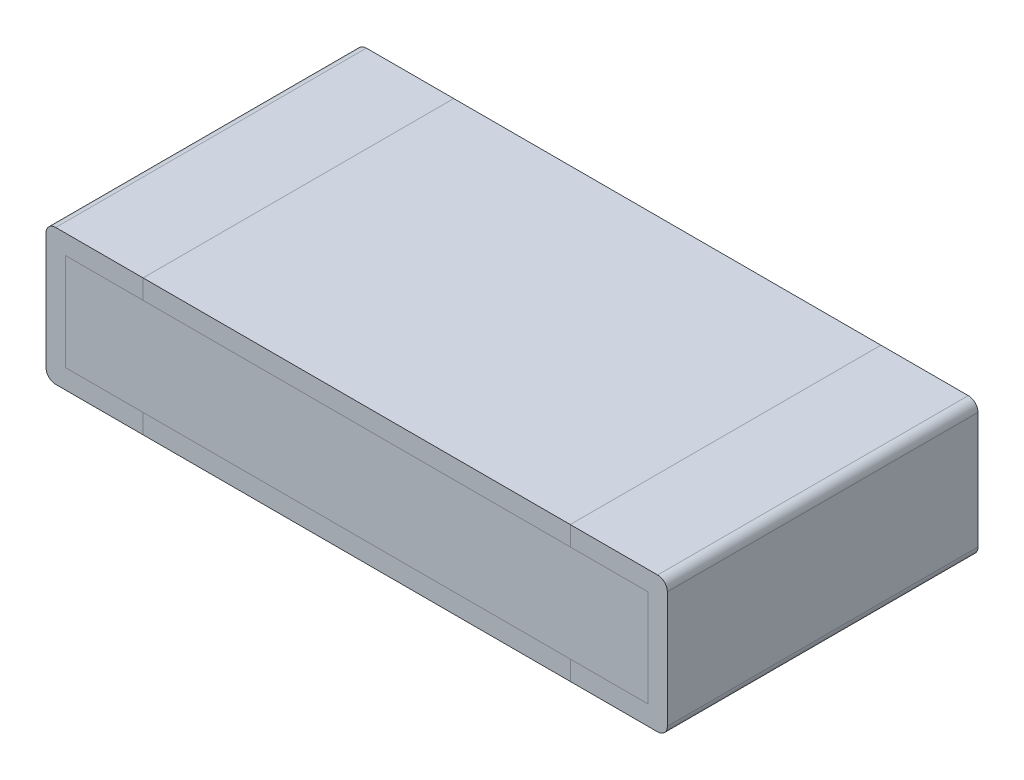
ISO-10303-21;
HEADER;
FILE_DESCRIPTION(('STEP AP214'),'2;1');
FILE_NAME('part.step','',(''),(''),'','','');
FILE_SCHEMA(('AUTOMOTIVE_DESIGN { 1 0 10303 214 1 1 1 1 }'));
ENDSEC;
DATA;
#1=APPLICATION_CONTEXT('core data for automotive mechanical design processes');
#2=APPLICATION_PROTOCOL_DEFINITION('international standard','automotive_design',2000,#1);
#3=PRODUCT_CONTEXT('',#1,'mechanical');
#4=PRODUCT('Part','Part','',(#3));
#5=PRODUCT_RELATED_PRODUCT_CATEGORY('part','',(#4));
#6=PRODUCT_DEFINITION_FORMATION('','',#4);
#7=PRODUCT_DEFINITION_CONTEXT('part definition',#1,'design');
#8=PRODUCT_DEFINITION('design','',#6,#7);
#9=PRODUCT_DEFINITION_SHAPE('','',#8);
#10=(LENGTH_UNIT() NAMED_UNIT(*) SI_UNIT(.MILLI.,.METRE.));
#11=(NAMED_UNIT(*) PLANE_ANGLE_UNIT() SI_UNIT($,.RADIAN.));
#12=(NAMED_UNIT(*) SI_UNIT($,.STERADIAN.) SOLID_ANGLE_UNIT());
#13=UNCERTAINTY_MEASURE_WITH_UNIT(LENGTH_MEASURE(1.E-05),#10,'distance_accuracy_value','');
#14=(GEOMETRIC_REPRESENTATION_CONTEXT(3) GLOBAL_UNCERTAINTY_ASSIGNED_CONTEXT((#13)) GLOBAL_UNIT_ASSIGNED_CONTEXT((#10,
#11,#12)) REPRESENTATION_CONTEXT('',''));
#15=CARTESIAN_POINT('',(0.,0.,0.));
#16=DIRECTION('',(0.,0.,1.));
#17=DIRECTION('',(1.,0.,0.));
#18=AXIS2_PLACEMENT_3D('',#15,#16,#17);
#19=CARTESIAN_POINT('',(0.,0.1,0.));
#20=DIRECTION('',(0.,-1.,0.));
#21=DIRECTION('',(0.,0.,-1.));
#22=AXIS2_PLACEMENT_3D('',#19,#20,#21);
#23=PLANE('',#22);
#24=DIRECTION('',(0.,0.,-1.));
#25=VECTOR('',#24,1.);
#26=CARTESIAN_POINT('',(-1.5,0.1,0.8));
#27=LINE('',#26,#25);
#28=CARTESIAN_POINT('',(-1.5,0.1,0.8));
#29=VERTEX_POINT('',#28);
#30=CARTESIAN_POINT('',(-1.5,0.1,-0.8));
#31=VERTEX_POINT('',#30);
#32=EDGE_CURVE('P0_E54',#29,#31,#27,.T.);
#33=ORIENTED_EDGE('',*,*,#32,.T.);
#34=DIRECTION('',(1.,0.,0.));
#35=VECTOR('',#34,1.);
#36=CARTESIAN_POINT('',(-1.5,0.1,-0.8));
#37=LINE('',#36,#35);
#38=CARTESIAN_POINT('',(1.5,0.1,-0.8));
#39=VERTEX_POINT('',#38);
#40=EDGE_CURVE('P0_E76',#31,#39,#37,.T.);
#41=ORIENTED_EDGE('',*,*,#40,.T.);
#42=DIRECTION('',(0.,0.,-1.));
#43=VECTOR('',#42,1.);
#44=CARTESIAN_POINT('',(1.5,0.1,0.));
#45=LINE('',#44,#43);
#46=CARTESIAN_POINT('',(1.5,0.1,0.8));
#47=VERTEX_POINT('',#46);
#48=EDGE_CURVE('P0_E19',#39,#47,#45,.F.);
#49=ORIENTED_EDGE('',*,*,#48,.T.);
#50=DIRECTION('',(-1.,0.,0.));
#51=VECTOR('',#50,1.);
#52=CARTESIAN_POINT('',(-1.5,0.1,0.8));
#53=LINE('',#52,#51);
#54=EDGE_CURVE('P0_E57',#47,#29,#53,.T.);
#55=ORIENTED_EDGE('',*,*,#54,.T.);
#56=EDGE_LOOP('',(#33,#41,#49,#55));
#57=FACE_BOUND('',#56,.T.);
#58=ADVANCED_FACE('P0_F16',(#57),#23,.T.);
#59=CARTESIAN_POINT('',(-1.5,0.6,0.8));
#60=DIRECTION('',(0.,0.,-1.));
#61=DIRECTION('',(-1.,0.,0.));
#62=AXIS2_PLACEMENT_3D('',#59,#60,#61);
#63=PLANE('',#62);
#64=DIRECTION('',(0.,1.,0.));
#65=VECTOR('',#64,1.);
#66=CARTESIAN_POINT('',(1.5,0.6,0.8));
#67=LINE('',#66,#65);
#68=CARTESIAN_POINT('',(1.5,0.6,0.8));
#69=VERTEX_POINT('',#68);
#70=EDGE_CURVE('P0_E78',#47,#69,#67,.T.);
#71=ORIENTED_EDGE('',*,*,#70,.T.);
#72=DIRECTION('',(1.,0.,0.));
#73=VECTOR('',#72,1.);
#74=CARTESIAN_POINT('',(0.,0.6,0.8));
#75=LINE('',#74,#73);
#76=CARTESIAN_POINT('',(-1.5,0.6,0.8));
#77=VERTEX_POINT('',#76);
#78=EDGE_CURVE('P0_E72',#69,#77,#75,.F.);
#79=ORIENTED_EDGE('',*,*,#78,.T.);
#80=DIRECTION('',(0.,1.,0.));
#81=VECTOR('',#80,1.);
#82=CARTESIAN_POINT('',(-1.5,0.6,0.8));
#83=LINE('',#82,#81);
#84=EDGE_CURVE('P0_E62',#77,#29,#83,.F.);
#85=ORIENTED_EDGE('',*,*,#84,.T.);
#86=ORIENTED_EDGE('',*,*,#54,.F.);
#87=EDGE_LOOP('',(#71,#79,#85,#86));
#88=FACE_BOUND('',#87,.T.);
#89=ADVANCED_FACE('P0_F71',(#88),#63,.F.);
#90=CARTESIAN_POINT('',(-1.5,0.6,0.8));
#91=DIRECTION('',(1.,0.,0.));
#92=DIRECTION('',(0.,0.,-1.));
#93=AXIS2_PLACEMENT_3D('',#90,#91,#92);
#94=PLANE('',#93);
#95=ORIENTED_EDGE('',*,*,#84,.F.);
#96=DIRECTION('',(0.,0.,-1.));
#97=VECTOR('',#96,1.);
#98=CARTESIAN_POINT('',(-1.5,0.6,0.));
#99=LINE('',#98,#97);
#100=CARTESIAN_POINT('',(-1.5,0.6,-0.8));
#101=VERTEX_POINT('',#100);
#102=EDGE_CURVE('P0_E82',#77,#101,#99,.T.);
#103=ORIENTED_EDGE('',*,*,#102,.T.);
#104=DIRECTION('',(0.,1.,0.));
#105=VECTOR('',#104,1.);
#106=CARTESIAN_POINT('',(-1.5,0.6,-0.8));
#107=LINE('',#106,#105);
#108=EDGE_CURVE('P0_E68',#101,#31,#107,.F.);
#109=ORIENTED_EDGE('',*,*,#108,.T.);
#110=ORIENTED_EDGE('',*,*,#32,.F.);
#111=EDGE_LOOP('',(#95,#103,#109,#110));
#112=FACE_BOUND('',#111,.T.);
#113=ADVANCED_FACE('P0_F65',(#112),#94,.F.);
#114=CARTESIAN_POINT('',(-1.5,0.6,-0.8));
#115=DIRECTION('',(0.,0.,1.));
#116=DIRECTION('',(1.,0.,0.));
#117=AXIS2_PLACEMENT_3D('',#114,#115,#116);
#118=PLANE('',#117);
#119=ORIENTED_EDGE('',*,*,#108,.F.);
#120=DIRECTION('',(1.,0.,0.));
#121=VECTOR('',#120,1.);
#122=CARTESIAN_POINT('',(0.,0.6,-0.8));
#123=LINE('',#122,#121);
#124=CARTESIAN_POINT('',(1.5,0.6,-0.8));
#125=VERTEX_POINT('',#124);
#126=EDGE_CURVE('P0_E25',#101,#125,#123,.T.);
#127=ORIENTED_EDGE('',*,*,#126,.T.);
#128=DIRECTION('',(0.,1.,0.));
#129=VECTOR('',#128,1.);
#130=CARTESIAN_POINT('',(1.5,0.6,-0.8));
#131=LINE('',#130,#129);
#132=EDGE_CURVE('P0_E33',#125,#39,#131,.F.);
#133=ORIENTED_EDGE('',*,*,#132,.T.);
#134=ORIENTED_EDGE('',*,*,#40,.F.);
#135=EDGE_LOOP('',(#119,#127,#133,#134));
#136=FACE_BOUND('',#135,.T.);
#137=ADVANCED_FACE('P0_F87',(#136),#118,.F.);
#138=CARTESIAN_POINT('',(1.5,0.6,0.8));
#139=DIRECTION('',(-1.,0.,0.));
#140=DIRECTION('',(0.,0.,1.));
#141=AXIS2_PLACEMENT_3D('',#138,#139,#140);
#142=PLANE('',#141);
#143=ORIENTED_EDGE('',*,*,#132,.F.);
#144=DIRECTION('',(0.,0.,-1.));
#145=VECTOR('',#144,1.);
#146=CARTESIAN_POINT('',(1.5,0.6,0.));
#147=LINE('',#146,#145);
#148=EDGE_CURVE('P0_E11',#125,#69,#147,.F.);
#149=ORIENTED_EDGE('',*,*,#148,.T.);
#150=ORIENTED_EDGE('',*,*,#70,.F.);
#151=ORIENTED_EDGE('',*,*,#48,.F.);
#152=EDGE_LOOP('',(#143,#149,#150,#151));
#153=FACE_BOUND('',#152,.T.);
#154=ADVANCED_FACE('P0_F90',(#153),#142,.F.);
#155=CARTESIAN_POINT('',(0.,0.6,0.));
#156=DIRECTION('',(0.,-1.,0.));
#157=DIRECTION('',(0.,0.,-1.));
#158=AXIS2_PLACEMENT_3D('',#155,#156,#157);
#159=PLANE('',#158);
#160=ORIENTED_EDGE('',*,*,#126,.F.);
#161=ORIENTED_EDGE('',*,*,#102,.F.);
#162=ORIENTED_EDGE('',*,*,#78,.F.);
#163=ORIENTED_EDGE('',*,*,#148,.F.);
#164=EDGE_LOOP('',(#160,#161,#162,#163));
#165=FACE_BOUND('',#164,.T.);
#166=ADVANCED_FACE('P0_F89',(#165),#159,.F.);
#167=CLOSED_SHELL('',(#58,#89,#113,#137,#154,#166));
#168=MANIFOLD_SOLID_BREP('P0_B1',#167);
#169=CARTESIAN_POINT('',(1.5,0.1,-0.8));
#170=DIRECTION('',(-1.,0.,0.));
#171=DIRECTION('',(0.,0.,1.));
#172=AXIS2_PLACEMENT_3D('',#169,#170,#171);
#173=PLANE('',#172);
#174=DIRECTION('',(0.,0.,1.));
#175=VECTOR('',#174,1.);
#176=CARTESIAN_POINT('',(1.5,0.1,-0.8));
#177=LINE('',#176,#175);
#178=CARTESIAN_POINT('',(1.5,0.1,0.8));
#179=VERTEX_POINT('',#178);
#180=CARTESIAN_POINT('',(1.5,0.1,-0.8));
#181=VERTEX_POINT('',#180);
#182=EDGE_CURVE('P1_E190',#179,#181,#177,.F.);
#183=ORIENTED_EDGE('',*,*,#182,.F.);
#184=DIRECTION('',(0.,1.,0.));
#185=VECTOR('',#184,1.);
#186=CARTESIAN_POINT('',(1.5,0.1,0.8));
#187=LINE('',#186,#185);
#188=CARTESIAN_POINT('',(1.5,0.6,0.8));
#189=VERTEX_POINT('',#188);
#190=EDGE_CURVE('P1_E197',#179,#189,#187,.T.);
#191=ORIENTED_EDGE('',*,*,#190,.T.);
#192=DIRECTION('',(0.,0.,-1.));
#193=VECTOR('',#192,1.);
#194=CARTESIAN_POINT('',(1.5,0.6,-0.8));
#195=LINE('',#194,#193);
#196=CARTESIAN_POINT('',(1.5,0.6,-0.8));
#197=VERTEX_POINT('',#196);
#198=EDGE_CURVE('P1_E171',#197,#189,#195,.F.);
#199=ORIENTED_EDGE('',*,*,#198,.F.);
#200=DIRECTION('',(0.,1.,0.));
#201=VECTOR('',#200,1.);
#202=CARTESIAN_POINT('',(1.5,0.1,-0.8));
#203=LINE('',#202,#201);
#204=EDGE_CURVE('P1_E199',#197,#181,#203,.F.);
#205=ORIENTED_EDGE('',*,*,#204,.T.);
#206=EDGE_LOOP('',(#183,#191,#199,#205));
#207=FACE_BOUND('',#206,.T.);
#208=ADVANCED_FACE('P1_F16',(#207),#173,.T.);
#209=CARTESIAN_POINT('',(1.1,0.1,-0.8));
#210=DIRECTION('',(0.,1.,0.));
#211=DIRECTION('',(0.,0.,1.));
#212=AXIS2_PLACEMENT_3D('',#209,#210,#211);
#213=PLANE('',#212);
#214=DIRECTION('',(0.,0.,1.));
#215=VECTOR('',#214,1.);
#216=CARTESIAN_POINT('',(1.1,0.1,-0.8));
#217=LINE('',#216,#215);
#218=CARTESIAN_POINT('',(1.1,0.1,0.8));
#219=VERTEX_POINT('',#218);
#220=CARTESIAN_POINT('',(1.1,0.1,-0.8));
#221=VERTEX_POINT('',#220);
#222=EDGE_CURVE('P1_E163',#219,#221,#217,.F.);
#223=ORIENTED_EDGE('',*,*,#222,.F.);
#224=DIRECTION('',(1.,0.,0.));
#225=VECTOR('',#224,1.);
#226=CARTESIAN_POINT('',(1.1,0.1,0.8));
#227=LINE('',#226,#225);
#228=EDGE_CURVE('P1_E177',#219,#179,#227,.T.);
#229=ORIENTED_EDGE('',*,*,#228,.T.);
#230=ORIENTED_EDGE('',*,*,#182,.T.);
#231=DIRECTION('',(1.,0.,0.));
#232=VECTOR('',#231,1.);
#233=CARTESIAN_POINT('',(1.1,0.1,-0.8));
#234=LINE('',#233,#232);
#235=EDGE_CURVE('P1_E186',#181,#221,#234,.F.);
#236=ORIENTED_EDGE('',*,*,#235,.T.);
#237=EDGE_LOOP('',(#223,#229,#230,#236));
#238=FACE_BOUND('',#237,.T.);
#239=ADVANCED_FACE('P1_F227',(#238),#213,.T.);
#240=CARTESIAN_POINT('',(1.5,0.6,-0.8));
#241=DIRECTION('',(0.,-1.,0.));
#242=DIRECTION('',(0.,0.,-1.));
#243=AXIS2_PLACEMENT_3D('',#240,#241,#242);
#244=PLANE('',#243);
#245=ORIENTED_EDGE('',*,*,#198,.T.);
#246=DIRECTION('',(1.,0.,0.));
#247=VECTOR('',#246,1.);
#248=CARTESIAN_POINT('',(1.5,0.6,0.8));
#249=LINE('',#248,#247);
#250=CARTESIAN_POINT('',(1.1,0.6,0.8));
#251=VERTEX_POINT('',#250);
#252=EDGE_CURVE('P1_E169',#189,#251,#249,.F.);
#253=ORIENTED_EDGE('',*,*,#252,.T.);
#254=DIRECTION('',(0.,0.,1.));
#255=VECTOR('',#254,1.);
#256=CARTESIAN_POINT('',(1.1,0.6,-0.8));
#257=LINE('',#256,#255);
#258=CARTESIAN_POINT('',(1.1,0.6,-0.8));
#259=VERTEX_POINT('',#258);
#260=EDGE_CURVE('P1_E151',#259,#251,#257,.T.);
#261=ORIENTED_EDGE('',*,*,#260,.F.);
#262=DIRECTION('',(1.,0.,0.));
#263=VECTOR('',#262,1.);
#264=CARTESIAN_POINT('',(1.5,0.6,-0.8));
#265=LINE('',#264,#263);
#266=EDGE_CURVE('P1_E174',#259,#197,#265,.T.);
#267=ORIENTED_EDGE('',*,*,#266,.T.);
#268=EDGE_LOOP('',(#245,#253,#261,#267));
#269=FACE_BOUND('',#268,.T.);
#270=ADVANCED_FACE('P1_F234',(#269),#244,.T.);
#271=CARTESIAN_POINT('',(1.1,0.,-0.8));
#272=DIRECTION('',(-1.,0.,0.));
#273=DIRECTION('',(0.,0.,1.));
#274=AXIS2_PLACEMENT_3D('',#271,#272,#273);
#275=PLANE('',#274);
#276=DIRECTION('',(0.,0.,-1.));
#277=VECTOR('',#276,1.);
#278=CARTESIAN_POINT('',(1.1,0.,-0.8));
#279=LINE('',#278,#277);
#280=CARTESIAN_POINT('',(1.1,0.,0.8));
#281=VERTEX_POINT('',#280);
#282=CARTESIAN_POINT('',(1.1,0.,-0.8));
#283=VERTEX_POINT('',#282);
#284=EDGE_CURVE('P1_E139',#281,#283,#279,.T.);
#285=ORIENTED_EDGE('',*,*,#284,.F.);
#286=DIRECTION('',(0.,1.,0.));
#287=VECTOR('',#286,1.);
#288=CARTESIAN_POINT('',(1.1,0.,0.8));
#289=LINE('',#288,#287);
#290=EDGE_CURVE('P1_E110',#281,#219,#289,.T.);
#291=ORIENTED_EDGE('',*,*,#290,.T.);
#292=ORIENTED_EDGE('',*,*,#222,.T.);
#293=DIRECTION('',(0.,1.,0.));
#294=VECTOR('',#293,1.);
#295=CARTESIAN_POINT('',(1.1,0.,-0.8));
#296=LINE('',#295,#294);
#297=EDGE_CURVE('P1_E158',#221,#283,#296,.F.);
#298=ORIENTED_EDGE('',*,*,#297,.T.);
#299=EDGE_LOOP('',(#285,#291,#292,#298));
#300=FACE_BOUND('',#299,.T.);
#301=ADVANCED_FACE('P1_F224',(#300),#275,.T.);
#302=CARTESIAN_POINT('',(1.1,0.6,-0.8));
#303=DIRECTION('',(-1.,0.,0.));
#304=DIRECTION('',(0.,0.,1.));
#305=AXIS2_PLACEMENT_3D('',#302,#303,#304);
#306=PLANE('',#305);
#307=ORIENTED_EDGE('',*,*,#260,.T.);
#308=DIRECTION('',(0.,1.,0.));
#309=VECTOR('',#308,1.);
#310=CARTESIAN_POINT('',(1.1,0.6,0.8));
#311=LINE('',#310,#309);
#312=CARTESIAN_POINT('',(1.1,0.7,0.8));
#313=VERTEX_POINT('',#312);
#314=EDGE_CURVE('P1_E104',#251,#313,#311,.T.);
#315=ORIENTED_EDGE('',*,*,#314,.T.);
#316=DIRECTION('',(0.,0.,1.));
#317=VECTOR('',#316,1.);
#318=CARTESIAN_POINT('',(1.1,0.7,-0.8));
#319=LINE('',#318,#317);
#320=CARTESIAN_POINT('',(1.1,0.7,-0.8));
#321=VERTEX_POINT('',#320);
#322=EDGE_CURVE('P1_E114',#321,#313,#319,.T.);
#323=ORIENTED_EDGE('',*,*,#322,.F.);
#324=DIRECTION('',(0.,1.,0.));
#325=VECTOR('',#324,1.);
#326=CARTESIAN_POINT('',(1.1,0.6,-0.8));
#327=LINE('',#326,#325);
#328=EDGE_CURVE('P1_E148',#321,#259,#327,.F.);
#329=ORIENTED_EDGE('',*,*,#328,.T.);
#330=EDGE_LOOP('',(#307,#315,#323,#329));
#331=FACE_BOUND('',#330,.T.);
#332=ADVANCED_FACE('P1_F235',(#331),#306,.T.);
#333=CARTESIAN_POINT('',(1.6,0.,-0.8));
#334=DIRECTION('',(0.,-1.,0.));
#335=DIRECTION('',(0.,0.,-1.));
#336=AXIS2_PLACEMENT_3D('',#333,#334,#335);
#337=PLANE('',#336);
#338=DIRECTION('',(1.,0.,0.));
#339=VECTOR('',#338,1.);
#340=CARTESIAN_POINT('',(0.,0.,0.8));
#341=LINE('',#340,#339);
#342=CARTESIAN_POINT('',(1.55,0.,0.8));
#343=VERTEX_POINT('',#342);
#344=EDGE_CURVE('P1_E106',#281,#343,#341,.T.);
#345=ORIENTED_EDGE('',*,*,#344,.F.);
#346=ORIENTED_EDGE('',*,*,#284,.T.);
#347=DIRECTION('',(1.,0.,0.));
#348=VECTOR('',#347,1.);
#349=CARTESIAN_POINT('',(1.6,0.,-0.8));
#350=LINE('',#349,#348);
#351=CARTESIAN_POINT('',(1.55,0.,-0.8));
#352=VERTEX_POINT('',#351);
#353=EDGE_CURVE('P1_E119',#283,#352,#350,.T.);
#354=ORIENTED_EDGE('',*,*,#353,.T.);
#355=DIRECTION('',(0.,0.,1.));
#356=VECTOR('',#355,1.);
#357=CARTESIAN_POINT('',(1.55,0.,-0.8));
#358=LINE('',#357,#356);
#359=EDGE_CURVE('P1_E117',#343,#352,#358,.F.);
#360=ORIENTED_EDGE('',*,*,#359,.F.);
#361=EDGE_LOOP('',(#345,#346,#354,#360));
#362=FACE_BOUND('',#361,.T.);
#363=ADVANCED_FACE('P1_F118',(#362),#337,.T.);
#364=CARTESIAN_POINT('',(1.1,0.7,-0.8));
#365=DIRECTION('',(0.,1.,0.));
#366=DIRECTION('',(0.,0.,1.));
#367=AXIS2_PLACEMENT_3D('',#364,#365,#366);
#368=PLANE('',#367);
#369=DIRECTION('',(1.,0.,0.));
#370=VECTOR('',#369,1.);
#371=CARTESIAN_POINT('',(0.,0.7,-0.8));
#372=LINE('',#371,#370);
#373=CARTESIAN_POINT('',(1.55,0.7,-0.8));
#374=VERTEX_POINT('',#373);
#375=EDGE_CURVE('P1_E122',#374,#321,#372,.F.);
#376=ORIENTED_EDGE('',*,*,#375,.T.);
#377=ORIENTED_EDGE('',*,*,#322,.T.);
#378=DIRECTION('',(1.,0.,0.));
#379=VECTOR('',#378,1.);
#380=CARTESIAN_POINT('',(0.,0.7,0.8));
#381=LINE('',#380,#379);
#382=CARTESIAN_POINT('',(1.55,0.7,0.8));
#383=VERTEX_POINT('',#382);
#384=EDGE_CURVE('P1_E64',#383,#313,#381,.F.);
#385=ORIENTED_EDGE('',*,*,#384,.F.);
#386=DIRECTION('',(0.,0.,1.));
#387=VECTOR('',#386,1.);
#388=CARTESIAN_POINT('',(1.55,0.7,-0.8));
#389=LINE('',#388,#387);
#390=EDGE_CURVE('P1_E134',#374,#383,#389,.T.);
#391=ORIENTED_EDGE('',*,*,#390,.F.);
#392=EDGE_LOOP('',(#376,#377,#385,#391));
#393=FACE_BOUND('',#392,.T.);
#394=ADVANCED_FACE('P1_F236',(#393),#368,.T.);
#395=CARTESIAN_POINT('',(0.,0.,0.8));
#396=DIRECTION('',(0.,0.,1.));
#397=DIRECTION('',(1.,0.,0.));
#398=AXIS2_PLACEMENT_3D('',#395,#396,#397);
#399=PLANE('',#398);
#400=ORIENTED_EDGE('',*,*,#228,.F.);
#401=ORIENTED_EDGE('',*,*,#290,.F.);
#402=ORIENTED_EDGE('',*,*,#344,.T.);
#403=CARTESIAN_POINT('',(1.55,0.05,0.8));
#404=DIRECTION('',(0.,0.,1.));
#405=DIRECTION('',(1.,0.,0.));
#406=AXIS2_PLACEMENT_3D('',#403,#404,#405);
#407=CIRCLE('',#406,0.05);
#408=CARTESIAN_POINT('',(1.6,0.05,0.8));
#409=VERTEX_POINT('',#408);
#410=EDGE_CURVE('P1_E19',#409,#343,#407,.F.);
#411=ORIENTED_EDGE('',*,*,#410,.F.);
#412=DIRECTION('',(0.,1.,0.));
#413=VECTOR('',#412,1.);
#414=CARTESIAN_POINT('',(1.6,0.7,0.8));
#415=LINE('',#414,#413);
#416=CARTESIAN_POINT('',(1.6,0.65,0.8));
#417=VERTEX_POINT('',#416);
#418=EDGE_CURVE('P1_E57',#417,#409,#415,.F.);
#419=ORIENTED_EDGE('',*,*,#418,.F.);
#420=CARTESIAN_POINT('',(1.55,0.65,0.8));
#421=DIRECTION('',(0.,0.,1.));
#422=DIRECTION('',(1.,0.,0.));
#423=AXIS2_PLACEMENT_3D('',#420,#421,#422);
#424=CIRCLE('',#423,0.05);
#425=EDGE_CURVE('P1_E136',#383,#417,#424,.F.);
#426=ORIENTED_EDGE('',*,*,#425,.F.);
#427=ORIENTED_EDGE('',*,*,#384,.T.);
#428=ORIENTED_EDGE('',*,*,#314,.F.);
#429=ORIENTED_EDGE('',*,*,#252,.F.);
#430=ORIENTED_EDGE('',*,*,#190,.F.);
#431=EDGE_LOOP('',(#400,#401,#402,#411,#419,#426,#427,#428,#429,#430));
#432=FACE_BOUND('',#431,.T.);
#433=ADVANCED_FACE('P1_F108',(#432),#399,.T.);
#434=CARTESIAN_POINT('',(1.55,0.05,-0.8));
#435=DIRECTION('',(0.,0.,1.));
#436=DIRECTION('',(1.,0.,0.));
#437=AXIS2_PLACEMENT_3D('',#434,#435,#436);
#438=CYLINDRICAL_SURFACE('',#437,0.05);
#439=ORIENTED_EDGE('',*,*,#410,.T.);
#440=ORIENTED_EDGE('',*,*,#359,.T.);
#441=CARTESIAN_POINT('',(1.55,0.05,-0.8));
#442=DIRECTION('',(0.,0.,1.));
#443=DIRECTION('',(1.,0.,0.));
#444=AXIS2_PLACEMENT_3D('',#441,#442,#443);
#445=CIRCLE('',#444,0.05);
#446=CARTESIAN_POINT('',(1.6,0.05,-0.8));
#447=VERTEX_POINT('',#446);
#448=EDGE_CURVE('P1_E210',#352,#447,#445,.T.);
#449=ORIENTED_EDGE('',*,*,#448,.T.);
#450=DIRECTION('',(0.,0.,-1.));
#451=VECTOR('',#450,1.);
#452=CARTESIAN_POINT('',(1.6,0.05,-0.8));
#453=LINE('',#452,#451);
#454=EDGE_CURVE('P1_E126',#409,#447,#453,.T.);
#455=ORIENTED_EDGE('',*,*,#454,.F.);
#456=EDGE_LOOP('',(#439,#440,#449,#455));
#457=FACE_BOUND('',#456,.T.);
#458=ADVANCED_FACE('P1_F124',(#457),#438,.T.);
#459=CARTESIAN_POINT('',(0.,0.,-0.8));
#460=DIRECTION('',(0.,0.,1.));
#461=DIRECTION('',(1.,0.,0.));
#462=AXIS2_PLACEMENT_3D('',#459,#460,#461);
#463=PLANE('',#462);
#464=ORIENTED_EDGE('',*,*,#448,.F.);
#465=ORIENTED_EDGE('',*,*,#353,.F.);
#466=ORIENTED_EDGE('',*,*,#297,.F.);
#467=ORIENTED_EDGE('',*,*,#235,.F.);
#468=ORIENTED_EDGE('',*,*,#204,.F.);
#469=ORIENTED_EDGE('',*,*,#266,.F.);
#470=ORIENTED_EDGE('',*,*,#328,.F.);
#471=ORIENTED_EDGE('',*,*,#375,.F.);
#472=CARTESIAN_POINT('',(1.55,0.65,-0.8));
#473=DIRECTION('',(0.,0.,1.));
#474=DIRECTION('',(1.,0.,0.));
#475=AXIS2_PLACEMENT_3D('',#472,#473,#474);
#476=CIRCLE('',#475,0.05);
#477=CARTESIAN_POINT('',(1.6,0.65,-0.8));
#478=VERTEX_POINT('',#477);
#479=EDGE_CURVE('P1_E34',#478,#374,#476,.T.);
#480=ORIENTED_EDGE('',*,*,#479,.F.);
#481=DIRECTION('',(0.,1.,0.));
#482=VECTOR('',#481,1.);
#483=CARTESIAN_POINT('',(1.6,0.7,-0.8));
#484=LINE('',#483,#482);
#485=EDGE_CURVE('P1_E25',#447,#478,#484,.T.);
#486=ORIENTED_EDGE('',*,*,#485,.F.);
#487=EDGE_LOOP('',(#464,#465,#466,#467,#468,#469,#470,#471,#480,#486));
#488=FACE_BOUND('',#487,.T.);
#489=ADVANCED_FACE('P1_F220',(#488),#463,.F.);
#490=CARTESIAN_POINT('',(1.55,0.65,-0.8));
#491=DIRECTION('',(0.,0.,1.));
#492=DIRECTION('',(1.,0.,0.));
#493=AXIS2_PLACEMENT_3D('',#490,#491,#492);
#494=CYLINDRICAL_SURFACE('',#493,0.05);
#495=ORIENTED_EDGE('',*,*,#425,.T.);
#496=DIRECTION('',(0.,0.,-1.));
#497=VECTOR('',#496,1.);
#498=CARTESIAN_POINT('',(1.6,0.65,-0.8));
#499=LINE('',#498,#497);
#500=EDGE_CURVE('P1_E11',#478,#417,#499,.F.);
#501=ORIENTED_EDGE('',*,*,#500,.F.);
#502=ORIENTED_EDGE('',*,*,#479,.T.);
#503=ORIENTED_EDGE('',*,*,#390,.T.);
#504=EDGE_LOOP('',(#495,#501,#502,#503));
#505=FACE_BOUND('',#504,.T.);
#506=ADVANCED_FACE('P1_F238',(#505),#494,.T.);
#507=CARTESIAN_POINT('',(1.6,0.7,-0.8));
#508=DIRECTION('',(1.,0.,0.));
#509=DIRECTION('',(0.,0.,-1.));
#510=AXIS2_PLACEMENT_3D('',#507,#508,#509);
#511=PLANE('',#510);
#512=ORIENTED_EDGE('',*,*,#485,.T.);
#513=ORIENTED_EDGE('',*,*,#500,.T.);
#514=ORIENTED_EDGE('',*,*,#418,.T.);
#515=ORIENTED_EDGE('',*,*,#454,.T.);
#516=EDGE_LOOP('',(#512,#513,#514,#515));
#517=FACE_BOUND('',#516,.T.);
#518=ADVANCED_FACE('P1_F219',(#517),#511,.T.);
#519=CLOSED_SHELL('',(#208,#239,#270,#301,#332,#363,#394,#433,#458,#489,#506,#518));
#520=MANIFOLD_SOLID_BREP('P1_B1',#519);
#521=CARTESIAN_POINT('',(0.,0.,0.));
#522=DIRECTION('',(0.,-1.,0.));
#523=DIRECTION('',(0.,0.,-1.));
#524=AXIS2_PLACEMENT_3D('',#521,#522,#523);
#525=PLANE('',#524);
#526=DIRECTION('',(0.,0.,-1.));
#527=VECTOR('',#526,1.);
#528=CARTESIAN_POINT('',(-1.1,0.,0.8));
#529=LINE('',#528,#527);
#530=CARTESIAN_POINT('',(-1.1,0.,0.8));
#531=VERTEX_POINT('',#530);
#532=CARTESIAN_POINT('',(-1.1,0.,-0.8));
#533=VERTEX_POINT('',#532);
#534=EDGE_CURVE('P2_E54',#531,#533,#529,.T.);
#535=ORIENTED_EDGE('',*,*,#534,.T.);
#536=DIRECTION('',(1.,0.,0.));
#537=VECTOR('',#536,1.);
#538=CARTESIAN_POINT('',(-1.1,0.,-0.8));
#539=LINE('',#538,#537);
#540=CARTESIAN_POINT('',(1.1,0.,-0.8));
#541=VERTEX_POINT('',#540);
#542=EDGE_CURVE('P2_E76',#533,#541,#539,.T.);
#543=ORIENTED_EDGE('',*,*,#542,.T.);
#544=DIRECTION('',(0.,0.,-1.));
#545=VECTOR('',#544,1.);
#546=CARTESIAN_POINT('',(1.1,0.,0.));
#547=LINE('',#546,#545);
#548=CARTESIAN_POINT('',(1.1,0.,0.8));
#549=VERTEX_POINT('',#548);
#550=EDGE_CURVE('P2_E19',#541,#549,#547,.F.);
#551=ORIENTED_EDGE('',*,*,#550,.T.);
#552=DIRECTION('',(-1.,0.,0.));
#553=VECTOR('',#552,1.);
#554=CARTESIAN_POINT('',(-1.1,0.,0.8));
#555=LINE('',#554,#553);
#556=EDGE_CURVE('P2_E57',#549,#531,#555,.T.);
#557=ORIENTED_EDGE('',*,*,#556,.T.);
#558=EDGE_LOOP('',(#535,#543,#551,#557));
#559=FACE_BOUND('',#558,.T.);
#560=ADVANCED_FACE('P2_F16',(#559),#525,.T.);
#561=CARTESIAN_POINT('',(-1.1,0.1,0.8));
#562=DIRECTION('',(0.,0.,-1.));
#563=DIRECTION('',(-1.,0.,0.));
#564=AXIS2_PLACEMENT_3D('',#561,#562,#563);
#565=PLANE('',#564);
#566=DIRECTION('',(0.,1.,0.));
#567=VECTOR('',#566,1.);
#568=CARTESIAN_POINT('',(1.1,0.1,0.8));
#569=LINE('',#568,#567);
#570=CARTESIAN_POINT('',(1.1,0.1,0.8));
#571=VERTEX_POINT('',#570);
#572=EDGE_CURVE('P2_E78',#549,#571,#569,.T.);
#573=ORIENTED_EDGE('',*,*,#572,.T.);
#574=DIRECTION('',(1.,0.,0.));
#575=VECTOR('',#574,1.);
#576=CARTESIAN_POINT('',(0.,0.1,0.8));
#577=LINE('',#576,#575);
#578=CARTESIAN_POINT('',(-1.1,0.1,0.8));
#579=VERTEX_POINT('',#578);
#580=EDGE_CURVE('P2_E72',#571,#579,#577,.F.);
#581=ORIENTED_EDGE('',*,*,#580,.T.);
#582=DIRECTION('',(0.,1.,0.));
#583=VECTOR('',#582,1.);
#584=CARTESIAN_POINT('',(-1.1,0.1,0.8));
#585=LINE('',#584,#583);
#586=EDGE_CURVE('P2_E62',#579,#531,#585,.F.);
#587=ORIENTED_EDGE('',*,*,#586,.T.);
#588=ORIENTED_EDGE('',*,*,#556,.F.);
#589=EDGE_LOOP('',(#573,#581,#587,#588));
#590=FACE_BOUND('',#589,.T.);
#591=ADVANCED_FACE('P2_F71',(#590),#565,.F.);
#592=CARTESIAN_POINT('',(-1.1,0.1,0.8));
#593=DIRECTION('',(1.,0.,0.));
#594=DIRECTION('',(0.,0.,-1.));
#595=AXIS2_PLACEMENT_3D('',#592,#593,#594);
#596=PLANE('',#595);
#597=ORIENTED_EDGE('',*,*,#586,.F.);
#598=DIRECTION('',(0.,0.,-1.));
#599=VECTOR('',#598,1.);
#600=CARTESIAN_POINT('',(-1.1,0.1,0.));
#601=LINE('',#600,#599);
#602=CARTESIAN_POINT('',(-1.1,0.1,-0.8));
#603=VERTEX_POINT('',#602);
#604=EDGE_CURVE('P2_E82',#579,#603,#601,.T.);
#605=ORIENTED_EDGE('',*,*,#604,.T.);
#606=DIRECTION('',(0.,1.,0.));
#607=VECTOR('',#606,1.);
#608=CARTESIAN_POINT('',(-1.1,0.1,-0.8));
#609=LINE('',#608,#607);
#610=EDGE_CURVE('P2_E68',#603,#533,#609,.F.);
#611=ORIENTED_EDGE('',*,*,#610,.T.);
#612=ORIENTED_EDGE('',*,*,#534,.F.);
#613=EDGE_LOOP('',(#597,#605,#611,#612));
#614=FACE_BOUND('',#613,.T.);
#615=ADVANCED_FACE('P2_F65',(#614),#596,.F.);
#616=CARTESIAN_POINT('',(-1.1,0.1,-0.8));
#617=DIRECTION('',(0.,0.,1.));
#618=DIRECTION('',(1.,0.,0.));
#619=AXIS2_PLACEMENT_3D('',#616,#617,#618);
#620=PLANE('',#619);
#621=ORIENTED_EDGE('',*,*,#610,.F.);
#622=DIRECTION('',(1.,0.,0.));
#623=VECTOR('',#622,1.);
#624=CARTESIAN_POINT('',(0.,0.1,-0.8));
#625=LINE('',#624,#623);
#626=CARTESIAN_POINT('',(1.1,0.1,-0.8));
#627=VERTEX_POINT('',#626);
#628=EDGE_CURVE('P2_E25',#603,#627,#625,.T.);
#629=ORIENTED_EDGE('',*,*,#628,.T.);
#630=DIRECTION('',(0.,1.,0.));
#631=VECTOR('',#630,1.);
#632=CARTESIAN_POINT('',(1.1,0.1,-0.8));
#633=LINE('',#632,#631);
#634=EDGE_CURVE('P2_E33',#627,#541,#633,.F.);
#635=ORIENTED_EDGE('',*,*,#634,.T.);
#636=ORIENTED_EDGE('',*,*,#542,.F.);
#637=EDGE_LOOP('',(#621,#629,#635,#636));
#638=FACE_BOUND('',#637,.T.);
#639=ADVANCED_FACE('P2_F87',(#638),#620,.F.);
#640=CARTESIAN_POINT('',(1.1,0.1,0.8));
#641=DIRECTION('',(-1.,0.,0.));
#642=DIRECTION('',(0.,0.,1.));
#643=AXIS2_PLACEMENT_3D('',#640,#641,#642);
#644=PLANE('',#643);
#645=ORIENTED_EDGE('',*,*,#634,.F.);
#646=DIRECTION('',(0.,0.,-1.));
#647=VECTOR('',#646,1.);
#648=CARTESIAN_POINT('',(1.1,0.1,0.));
#649=LINE('',#648,#647);
#650=EDGE_CURVE('P2_E11',#627,#571,#649,.F.);
#651=ORIENTED_EDGE('',*,*,#650,.T.);
#652=ORIENTED_EDGE('',*,*,#572,.F.);
#653=ORIENTED_EDGE('',*,*,#550,.F.);
#654=EDGE_LOOP('',(#645,#651,#652,#653));
#655=FACE_BOUND('',#654,.T.);
#656=ADVANCED_FACE('P2_F90',(#655),#644,.F.);
#657=CARTESIAN_POINT('',(0.,0.1,0.));
#658=DIRECTION('',(0.,-1.,0.));
#659=DIRECTION('',(0.,0.,-1.));
#660=AXIS2_PLACEMENT_3D('',#657,#658,#659);
#661=PLANE('',#660);
#662=ORIENTED_EDGE('',*,*,#628,.F.);
#663=ORIENTED_EDGE('',*,*,#604,.F.);
#664=ORIENTED_EDGE('',*,*,#580,.F.);
#665=ORIENTED_EDGE('',*,*,#650,.F.);
#666=EDGE_LOOP('',(#662,#663,#664,#665));
#667=FACE_BOUND('',#666,.T.);
#668=ADVANCED_FACE('P2_F89',(#667),#661,.F.);
#669=CLOSED_SHELL('',(#560,#591,#615,#639,#656,#668));
#670=MANIFOLD_SOLID_BREP('P2_B1',#669);
#671=CARTESIAN_POINT('',(0.,0.6,0.));
#672=DIRECTION('',(0.,-1.,0.));
#673=DIRECTION('',(0.,0.,-1.));
#674=AXIS2_PLACEMENT_3D('',#671,#672,#673);
#675=PLANE('',#674);
#676=DIRECTION('',(0.,0.,-1.));
#677=VECTOR('',#676,1.);
#678=CARTESIAN_POINT('',(-1.1,0.6,0.8));
#679=LINE('',#678,#677);
#680=CARTESIAN_POINT('',(-1.1,0.6,0.8));
#681=VERTEX_POINT('',#680);
#682=CARTESIAN_POINT('',(-1.1,0.6,-0.8));
#683=VERTEX_POINT('',#682);
#684=EDGE_CURVE('P3_E54',#681,#683,#679,.T.);
#685=ORIENTED_EDGE('',*,*,#684,.T.);
#686=DIRECTION('',(1.,0.,0.));
#687=VECTOR('',#686,1.);
#688=CARTESIAN_POINT('',(-1.1,0.6,-0.8));
#689=LINE('',#688,#687);
#690=CARTESIAN_POINT('',(1.1,0.6,-0.8));
#691=VERTEX_POINT('',#690);
#692=EDGE_CURVE('P3_E76',#683,#691,#689,.T.);
#693=ORIENTED_EDGE('',*,*,#692,.T.);
#694=DIRECTION('',(0.,0.,-1.));
#695=VECTOR('',#694,1.);
#696=CARTESIAN_POINT('',(1.1,0.6,0.));
#697=LINE('',#696,#695);
#698=CARTESIAN_POINT('',(1.1,0.6,0.8));
#699=VERTEX_POINT('',#698);
#700=EDGE_CURVE('P3_E19',#691,#699,#697,.F.);
#701=ORIENTED_EDGE('',*,*,#700,.T.);
#702=DIRECTION('',(-1.,0.,0.));
#703=VECTOR('',#702,1.);
#704=CARTESIAN_POINT('',(-1.1,0.6,0.8));
#705=LINE('',#704,#703);
#706=EDGE_CURVE('P3_E57',#699,#681,#705,.T.);
#707=ORIENTED_EDGE('',*,*,#706,.T.);
#708=EDGE_LOOP('',(#685,#693,#701,#707));
#709=FACE_BOUND('',#708,.T.);
#710=ADVANCED_FACE('P3_F16',(#709),#675,.T.);
#711=CARTESIAN_POINT('',(-1.1,0.7,0.8));
#712=DIRECTION('',(0.,0.,-1.));
#713=DIRECTION('',(-1.,0.,0.));
#714=AXIS2_PLACEMENT_3D('',#711,#712,#713);
#715=PLANE('',#714);
#716=DIRECTION('',(0.,1.,0.));
#717=VECTOR('',#716,1.);
#718=CARTESIAN_POINT('',(1.1,0.7,0.8));
#719=LINE('',#718,#717);
#720=CARTESIAN_POINT('',(1.1,0.7,0.8));
#721=VERTEX_POINT('',#720);
#722=EDGE_CURVE('P3_E78',#699,#721,#719,.T.);
#723=ORIENTED_EDGE('',*,*,#722,.T.);
#724=DIRECTION('',(1.,0.,0.));
#725=VECTOR('',#724,1.);
#726=CARTESIAN_POINT('',(0.,0.7,0.8));
#727=LINE('',#726,#725);
#728=CARTESIAN_POINT('',(-1.1,0.7,0.8));
#729=VERTEX_POINT('',#728);
#730=EDGE_CURVE('P3_E72',#721,#729,#727,.F.);
#731=ORIENTED_EDGE('',*,*,#730,.T.);
#732=DIRECTION('',(0.,1.,0.));
#733=VECTOR('',#732,1.);
#734=CARTESIAN_POINT('',(-1.1,0.7,0.8));
#735=LINE('',#734,#733);
#736=EDGE_CURVE('P3_E62',#729,#681,#735,.F.);
#737=ORIENTED_EDGE('',*,*,#736,.T.);
#738=ORIENTED_EDGE('',*,*,#706,.F.);
#739=EDGE_LOOP('',(#723,#731,#737,#738));
#740=FACE_BOUND('',#739,.T.);
#741=ADVANCED_FACE('P3_F71',(#740),#715,.F.);
#742=CARTESIAN_POINT('',(-1.1,0.7,0.8));
#743=DIRECTION('',(1.,0.,0.));
#744=DIRECTION('',(0.,0.,-1.));
#745=AXIS2_PLACEMENT_3D('',#742,#743,#744);
#746=PLANE('',#745);
#747=ORIENTED_EDGE('',*,*,#736,.F.);
#748=DIRECTION('',(0.,0.,-1.));
#749=VECTOR('',#748,1.);
#750=CARTESIAN_POINT('',(-1.1,0.7,0.));
#751=LINE('',#750,#749);
#752=CARTESIAN_POINT('',(-1.1,0.7,-0.8));
#753=VERTEX_POINT('',#752);
#754=EDGE_CURVE('P3_E82',#729,#753,#751,.T.);
#755=ORIENTED_EDGE('',*,*,#754,.T.);
#756=DIRECTION('',(0.,1.,0.));
#757=VECTOR('',#756,1.);
#758=CARTESIAN_POINT('',(-1.1,0.7,-0.8));
#759=LINE('',#758,#757);
#760=EDGE_CURVE('P3_E68',#753,#683,#759,.F.);
#761=ORIENTED_EDGE('',*,*,#760,.T.);
#762=ORIENTED_EDGE('',*,*,#684,.F.);
#763=EDGE_LOOP('',(#747,#755,#761,#762));
#764=FACE_BOUND('',#763,.T.);
#765=ADVANCED_FACE('P3_F65',(#764),#746,.F.);
#766=CARTESIAN_POINT('',(-1.1,0.7,-0.8));
#767=DIRECTION('',(0.,0.,1.));
#768=DIRECTION('',(1.,0.,0.));
#769=AXIS2_PLACEMENT_3D('',#766,#767,#768);
#770=PLANE('',#769);
#771=ORIENTED_EDGE('',*,*,#760,.F.);
#772=DIRECTION('',(1.,0.,0.));
#773=VECTOR('',#772,1.);
#774=CARTESIAN_POINT('',(0.,0.7,-0.8));
#775=LINE('',#774,#773);
#776=CARTESIAN_POINT('',(1.1,0.7,-0.8));
#777=VERTEX_POINT('',#776);
#778=EDGE_CURVE('P3_E25',#753,#777,#775,.T.);
#779=ORIENTED_EDGE('',*,*,#778,.T.);
#780=DIRECTION('',(0.,1.,0.));
#781=VECTOR('',#780,1.);
#782=CARTESIAN_POINT('',(1.1,0.7,-0.8));
#783=LINE('',#782,#781);
#784=EDGE_CURVE('P3_E33',#777,#691,#783,.F.);
#785=ORIENTED_EDGE('',*,*,#784,.T.);
#786=ORIENTED_EDGE('',*,*,#692,.F.);
#787=EDGE_LOOP('',(#771,#779,#785,#786));
#788=FACE_BOUND('',#787,.T.);
#789=ADVANCED_FACE('P3_F87',(#788),#770,.F.);
#790=CARTESIAN_POINT('',(1.1,0.7,0.8));
#791=DIRECTION('',(-1.,0.,0.));
#792=DIRECTION('',(0.,0.,1.));
#793=AXIS2_PLACEMENT_3D('',#790,#791,#792);
#794=PLANE('',#793);
#795=ORIENTED_EDGE('',*,*,#784,.F.);
#796=DIRECTION('',(0.,0.,-1.));
#797=VECTOR('',#796,1.);
#798=CARTESIAN_POINT('',(1.1,0.7,0.));
#799=LINE('',#798,#797);
#800=EDGE_CURVE('P3_E11',#777,#721,#799,.F.);
#801=ORIENTED_EDGE('',*,*,#800,.T.);
#802=ORIENTED_EDGE('',*,*,#722,.F.);
#803=ORIENTED_EDGE('',*,*,#700,.F.);
#804=EDGE_LOOP('',(#795,#801,#802,#803));
#805=FACE_BOUND('',#804,.T.);
#806=ADVANCED_FACE('P3_F90',(#805),#794,.F.);
#807=CARTESIAN_POINT('',(0.,0.7,0.));
#808=DIRECTION('',(0.,-1.,0.));
#809=DIRECTION('',(0.,0.,-1.));
#810=AXIS2_PLACEMENT_3D('',#807,#808,#809);
#811=PLANE('',#810);
#812=ORIENTED_EDGE('',*,*,#778,.F.);
#813=ORIENTED_EDGE('',*,*,#754,.F.);
#814=ORIENTED_EDGE('',*,*,#730,.F.);
#815=ORIENTED_EDGE('',*,*,#800,.F.);
#816=EDGE_LOOP('',(#812,#813,#814,#815));
#817=FACE_BOUND('',#816,.T.);
#818=ADVANCED_FACE('P3_F89',(#817),#811,.F.);
#819=CLOSED_SHELL('',(#710,#741,#765,#789,#806,#818));
#820=MANIFOLD_SOLID_BREP('P3_B1',#819);
#821=CARTESIAN_POINT('',(-1.5,0.1,-0.8));
#822=DIRECTION('',(1.,0.,0.));
#823=DIRECTION('',(0.,0.,-1.));
#824=AXIS2_PLACEMENT_3D('',#821,#822,#823);
#825=PLANE('',#824);
#826=DIRECTION('',(0.,0.,1.));
#827=VECTOR('',#826,1.);
#828=CARTESIAN_POINT('',(-1.5,0.1,-0.8));
#829=LINE('',#828,#827);
#830=CARTESIAN_POINT('',(-1.5,0.1,-0.8));
#831=VERTEX_POINT('',#830);
#832=CARTESIAN_POINT('',(-1.5,0.1,0.8));
#833=VERTEX_POINT('',#832);
#834=EDGE_CURVE('P4_E157',#831,#833,#829,.T.);
#835=ORIENTED_EDGE('',*,*,#834,.F.);
#836=DIRECTION('',(0.,1.,0.));
#837=VECTOR('',#836,1.);
#838=CARTESIAN_POINT('',(-1.5,0.1,-0.8));
#839=LINE('',#838,#837);
#840=CARTESIAN_POINT('',(-1.5,0.6,-0.8));
#841=VERTEX_POINT('',#840);
#842=EDGE_CURVE('P4_E164',#831,#841,#839,.T.);
#843=ORIENTED_EDGE('',*,*,#842,.T.);
#844=DIRECTION('',(0.,0.,-1.));
#845=VECTOR('',#844,1.);
#846=CARTESIAN_POINT('',(-1.5,0.6,-0.8));
#847=LINE('',#846,#845);
#848=CARTESIAN_POINT('',(-1.5,0.6,0.8));
#849=VERTEX_POINT('',#848);
#850=EDGE_CURVE('P4_E137',#849,#841,#847,.T.);
#851=ORIENTED_EDGE('',*,*,#850,.F.);
#852=DIRECTION('',(0.,1.,0.));
#853=VECTOR('',#852,1.);
#854=CARTESIAN_POINT('',(-1.5,0.1,0.8));
#855=LINE('',#854,#853);
#856=EDGE_CURVE('P4_E167',#849,#833,#855,.F.);
#857=ORIENTED_EDGE('',*,*,#856,.T.);
#858=EDGE_LOOP('',(#835,#843,#851,#857));
#859=FACE_BOUND('',#858,.T.);
#860=ADVANCED_FACE('P4_F16',(#859),#825,.T.);
#861=CARTESIAN_POINT('',(-1.1,0.1,-0.8));
#862=DIRECTION('',(0.,1.,0.));
#863=DIRECTION('',(0.,0.,1.));
#864=AXIS2_PLACEMENT_3D('',#861,#862,#863);
#865=PLANE('',#864);
#866=DIRECTION('',(0.,0.,-1.));
#867=VECTOR('',#866,1.);
#868=CARTESIAN_POINT('',(-1.1,0.1,-0.8));
#869=LINE('',#868,#867);
#870=CARTESIAN_POINT('',(-1.1,0.1,-0.8));
#871=VERTEX_POINT('',#870);
#872=CARTESIAN_POINT('',(-1.1,0.1,0.8));
#873=VERTEX_POINT('',#872);
#874=EDGE_CURVE('P4_E127',#871,#873,#869,.F.);
#875=ORIENTED_EDGE('',*,*,#874,.F.);
#876=DIRECTION('',(1.,0.,0.));
#877=VECTOR('',#876,1.);
#878=CARTESIAN_POINT('',(-1.1,0.1,-0.8));
#879=LINE('',#878,#877);
#880=EDGE_CURVE('P4_E143',#871,#831,#879,.F.);
#881=ORIENTED_EDGE('',*,*,#880,.T.);
#882=ORIENTED_EDGE('',*,*,#834,.T.);
#883=DIRECTION('',(1.,0.,0.));
#884=VECTOR('',#883,1.);
#885=CARTESIAN_POINT('',(-1.1,0.1,0.8));
#886=LINE('',#885,#884);
#887=EDGE_CURVE('P4_E152',#833,#873,#886,.T.);
#888=ORIENTED_EDGE('',*,*,#887,.T.);
#889=EDGE_LOOP('',(#875,#881,#882,#888));
#890=FACE_BOUND('',#889,.T.);
#891=ADVANCED_FACE('P4_F281',(#890),#865,.T.);
#892=CARTESIAN_POINT('',(-1.5,0.6,-0.8));
#893=DIRECTION('',(0.,-1.,0.));
#894=DIRECTION('',(0.,0.,-1.));
#895=AXIS2_PLACEMENT_3D('',#892,#893,#894);
#896=PLANE('',#895);
#897=ORIENTED_EDGE('',*,*,#850,.T.);
#898=DIRECTION('',(1.,0.,0.));
#899=VECTOR('',#898,1.);
#900=CARTESIAN_POINT('',(-1.5,0.6,-0.8));
#901=LINE('',#900,#899);
#902=CARTESIAN_POINT('',(-1.1,0.6,-0.8));
#903=VERTEX_POINT('',#902);
#904=EDGE_CURVE('P4_E134',#841,#903,#901,.T.);
#905=ORIENTED_EDGE('',*,*,#904,.T.);
#906=DIRECTION('',(0.,0.,-1.));
#907=VECTOR('',#906,1.);
#908=CARTESIAN_POINT('',(-1.1,0.6,-0.8));
#909=LINE('',#908,#907);
#910=CARTESIAN_POINT('',(-1.1,0.6,0.8));
#911=VERTEX_POINT('',#910);
#912=EDGE_CURVE('P4_E112',#911,#903,#909,.T.);
#913=ORIENTED_EDGE('',*,*,#912,.F.);
#914=DIRECTION('',(1.,0.,0.));
#915=VECTOR('',#914,1.);
#916=CARTESIAN_POINT('',(-1.5,0.6,0.8));
#917=LINE('',#916,#915);
#918=EDGE_CURVE('P4_E140',#911,#849,#917,.F.);
#919=ORIENTED_EDGE('',*,*,#918,.T.);
#920=EDGE_LOOP('',(#897,#905,#913,#919));
#921=FACE_BOUND('',#920,.T.);
#922=ADVANCED_FACE('P4_F271',(#921),#896,.T.);
#923=CARTESIAN_POINT('',(-1.1,0.,-0.8));
#924=DIRECTION('',(1.,0.,0.));
#925=DIRECTION('',(0.,0.,-1.));
#926=AXIS2_PLACEMENT_3D('',#923,#924,#925);
#927=PLANE('',#926);
#928=DIRECTION('',(0.,0.,-1.));
#929=VECTOR('',#928,1.);
#930=CARTESIAN_POINT('',(-1.1,0.,-0.8));
#931=LINE('',#930,#929);
#932=CARTESIAN_POINT('',(-1.1,0.,-0.8));
#933=VERTEX_POINT('',#932);
#934=CARTESIAN_POINT('',(-1.1,0.,0.8));
#935=VERTEX_POINT('',#934);
#936=EDGE_CURVE('P4_E96',#933,#935,#931,.F.);
#937=ORIENTED_EDGE('',*,*,#936,.F.);
#938=DIRECTION('',(0.,1.,0.));
#939=VECTOR('',#938,1.);
#940=CARTESIAN_POINT('',(-1.1,0.,-0.8));
#941=LINE('',#940,#939);
#942=EDGE_CURVE('P4_E113',#933,#871,#941,.T.);
#943=ORIENTED_EDGE('',*,*,#942,.T.);
#944=ORIENTED_EDGE('',*,*,#874,.T.);
#945=DIRECTION('',(0.,1.,0.));
#946=VECTOR('',#945,1.);
#947=CARTESIAN_POINT('',(-1.1,0.,0.8));
#948=LINE('',#947,#946);
#949=EDGE_CURVE('P4_E122',#873,#935,#948,.F.);
#950=ORIENTED_EDGE('',*,*,#949,.T.);
#951=EDGE_LOOP('',(#937,#943,#944,#950));
#952=FACE_BOUND('',#951,.T.);
#953=ADVANCED_FACE('P4_F261',(#952),#927,.T.);
#954=CARTESIAN_POINT('',(-1.1,0.6,-0.8));
#955=DIRECTION('',(1.,0.,0.));
#956=DIRECTION('',(0.,0.,-1.));
#957=AXIS2_PLACEMENT_3D('',#954,#955,#956);
#958=PLANE('',#957);
#959=ORIENTED_EDGE('',*,*,#912,.T.);
#960=DIRECTION('',(0.,1.,0.));
#961=VECTOR('',#960,1.);
#962=CARTESIAN_POINT('',(-1.1,0.6,-0.8));
#963=LINE('',#962,#961);
#964=CARTESIAN_POINT('',(-1.1,0.7,-0.8));
#965=VERTEX_POINT('',#964);
#966=EDGE_CURVE('P4_E102',#903,#965,#963,.T.);
#967=ORIENTED_EDGE('',*,*,#966,.T.);
#968=DIRECTION('',(0.,0.,1.));
#969=VECTOR('',#968,1.);
#970=CARTESIAN_POINT('',(-1.1,0.7,-0.8));
#971=LINE('',#970,#969);
#972=CARTESIAN_POINT('',(-1.1,0.7,0.8));
#973=VERTEX_POINT('',#972);
#974=EDGE_CURVE('P4_E91',#973,#965,#971,.F.);
#975=ORIENTED_EDGE('',*,*,#974,.F.);
#976=DIRECTION('',(0.,1.,0.));
#977=VECTOR('',#976,1.);
#978=CARTESIAN_POINT('',(-1.1,0.6,0.8));
#979=LINE('',#978,#977);
#980=EDGE_CURVE('P4_E109',#973,#911,#979,.F.);
#981=ORIENTED_EDGE('',*,*,#980,.T.);
#982=EDGE_LOOP('',(#959,#967,#975,#981));
#983=FACE_BOUND('',#982,.T.);
#984=ADVANCED_FACE('P4_F251',(#983),#958,.T.);
#985=CARTESIAN_POINT('',(-1.6,0.,-0.8));
#986=DIRECTION('',(0.,-1.,0.));
#987=DIRECTION('',(0.,0.,-1.));
#988=AXIS2_PLACEMENT_3D('',#985,#986,#987);
#989=PLANE('',#988);
#990=DIRECTION('',(1.,0.,0.));
#991=VECTOR('',#990,1.);
#992=CARTESIAN_POINT('',(0.,0.,-0.8));
#993=LINE('',#992,#991);
#994=CARTESIAN_POINT('',(-1.55,0.,-0.8));
#995=VERTEX_POINT('',#994);
#996=EDGE_CURVE('P4_E66',#995,#933,#993,.T.);
#997=ORIENTED_EDGE('',*,*,#996,.T.);
#998=ORIENTED_EDGE('',*,*,#936,.T.);
#999=DIRECTION('',(1.,0.,0.));
#1000=VECTOR('',#999,1.);
#1001=CARTESIAN_POINT('',(-1.6,0.,0.8));
#1002=LINE('',#1001,#1000);
#1003=CARTESIAN_POINT('',(-1.55,0.,0.8));
#1004=VERTEX_POINT('',#1003);
#1005=EDGE_CURVE('P4_E100',#935,#1004,#1002,.F.);
#1006=ORIENTED_EDGE('',*,*,#1005,.T.);
#1007=DIRECTION('',(0.,0.,1.));
#1008=VECTOR('',#1007,1.);
#1009=CARTESIAN_POINT('',(-1.55,0.,-0.8));
#1010=LINE('',#1009,#1008);
#1011=EDGE_CURVE('P4_E70',#995,#1004,#1010,.T.);
#1012=ORIENTED_EDGE('',*,*,#1011,.F.);
#1013=EDGE_LOOP('',(#997,#998,#1006,#1012));
#1014=FACE_BOUND('',#1013,.T.);
#1015=ADVANCED_FACE('P4_F241',(#1014),#989,.T.);
#1016=CARTESIAN_POINT('',(-1.1,0.7,-0.8));
#1017=DIRECTION('',(0.,1.,0.));
#1018=DIRECTION('',(0.,0.,1.));
#1019=AXIS2_PLACEMENT_3D('',#1016,#1017,#1018);
#1020=PLANE('',#1019);
#1021=DIRECTION('',(1.,0.,0.));
#1022=VECTOR('',#1021,1.);
#1023=CARTESIAN_POINT('',(0.,0.7,0.8));
#1024=LINE('',#1023,#1022);
#1025=CARTESIAN_POINT('',(-1.55,0.7,0.8));
#1026=VERTEX_POINT('',#1025);
#1027=EDGE_CURVE('P4_E180',#973,#1026,#1024,.F.);
#1028=ORIENTED_EDGE('',*,*,#1027,.F.);
#1029=ORIENTED_EDGE('',*,*,#974,.T.);
#1030=DIRECTION('',(1.,0.,0.));
#1031=VECTOR('',#1030,1.);
#1032=CARTESIAN_POINT('',(0.,0.7,-0.8));
#1033=LINE('',#1032,#1031);
#1034=CARTESIAN_POINT('',(-1.55,0.7,-0.8));
#1035=VERTEX_POINT('',#1034);
#1036=EDGE_CURVE('P4_E87',#965,#1035,#1033,.F.);
#1037=ORIENTED_EDGE('',*,*,#1036,.T.);
#1038=DIRECTION('',(0.,0.,1.));
#1039=VECTOR('',#1038,1.);
#1040=CARTESIAN_POINT('',(-1.55,0.7,-0.8));
#1041=LINE('',#1040,#1039);
#1042=EDGE_CURVE('P4_E80',#1026,#1035,#1041,.F.);
#1043=ORIENTED_EDGE('',*,*,#1042,.F.);
#1044=EDGE_LOOP('',(#1028,#1029,#1037,#1043));
#1045=FACE_BOUND('',#1044,.T.);
#1046=ADVANCED_FACE('P4_F232',(#1045),#1020,.T.);
#1047=CARTESIAN_POINT('',(0.,0.,-0.8));
#1048=DIRECTION('',(0.,0.,1.));
#1049=DIRECTION('',(1.,0.,0.));
#1050=AXIS2_PLACEMENT_3D('',#1047,#1048,#1049);
#1051=PLANE('',#1050);
#1052=CARTESIAN_POINT('',(-1.55,0.05,-0.8));
#1053=DIRECTION('',(0.,0.,1.));
#1054=DIRECTION('',(1.,0.,0.));
#1055=AXIS2_PLACEMENT_3D('',#1052,#1053,#1054);
#1056=CIRCLE('',#1055,0.05);
#1057=CARTESIAN_POINT('',(-1.6,0.05,-0.8));
#1058=VERTEX_POINT('',#1057);
#1059=EDGE_CURVE('P4_E19',#1058,#995,#1056,.T.);
#1060=ORIENTED_EDGE('',*,*,#1059,.F.);
#1061=DIRECTION('',(0.,1.,0.));
#1062=VECTOR('',#1061,1.);
#1063=CARTESIAN_POINT('',(-1.6,0.7,-0.8));
#1064=LINE('',#1063,#1062);
#1065=CARTESIAN_POINT('',(-1.6,0.65,-0.8));
#1066=VERTEX_POINT('',#1065);
#1067=EDGE_CURVE('P4_E62',#1066,#1058,#1064,.F.);
#1068=ORIENTED_EDGE('',*,*,#1067,.F.);
#1069=CARTESIAN_POINT('',(-1.55,0.65,-0.8));
#1070=DIRECTION('',(0.,0.,1.));
#1071=DIRECTION('',(1.,0.,0.));
#1072=AXIS2_PLACEMENT_3D('',#1069,#1070,#1071);
#1073=CIRCLE('',#1072,0.05);
#1074=EDGE_CURVE('P4_E179',#1035,#1066,#1073,.T.);
#1075=ORIENTED_EDGE('',*,*,#1074,.F.);
#1076=ORIENTED_EDGE('',*,*,#1036,.F.);
#1077=ORIENTED_EDGE('',*,*,#966,.F.);
#1078=ORIENTED_EDGE('',*,*,#904,.F.);
#1079=ORIENTED_EDGE('',*,*,#842,.F.);
#1080=ORIENTED_EDGE('',*,*,#880,.F.);
#1081=ORIENTED_EDGE('',*,*,#942,.F.);
#1082=ORIENTED_EDGE('',*,*,#996,.F.);
#1083=EDGE_LOOP('',(#1060,#1068,#1075,#1076,#1077,#1078,#1079,#1080,#1081,#1082));
#1084=FACE_BOUND('',#1083,.T.);
#1085=ADVANCED_FACE('P4_F59',(#1084),#1051,.F.);
#1086=CARTESIAN_POINT('',(-1.55,0.05,-0.8));
#1087=DIRECTION('',(0.,0.,1.));
#1088=DIRECTION('',(1.,0.,0.));
#1089=AXIS2_PLACEMENT_3D('',#1086,#1087,#1088);
#1090=CYLINDRICAL_SURFACE('',#1089,0.05);
#1091=CARTESIAN_POINT('',(-1.55,0.05,0.8));
#1092=DIRECTION('',(0.,0.,1.));
#1093=DIRECTION('',(1.,0.,0.));
#1094=AXIS2_PLACEMENT_3D('',#1091,#1092,#1093);
#1095=CIRCLE('',#1094,0.05);
#1096=CARTESIAN_POINT('',(-1.6,0.05,0.8));
#1097=VERTEX_POINT('',#1096);
#1098=EDGE_CURVE('P4_E75',#1097,#1004,#1095,.T.);
#1099=ORIENTED_EDGE('',*,*,#1098,.F.);
#1100=DIRECTION('',(0.,0.,1.));
#1101=VECTOR('',#1100,1.);
#1102=CARTESIAN_POINT('',(-1.6,0.05,-0.8));
#1103=LINE('',#1102,#1101);
#1104=EDGE_CURVE('P4_E72',#1058,#1097,#1103,.T.);
#1105=ORIENTED_EDGE('',*,*,#1104,.F.);
#1106=ORIENTED_EDGE('',*,*,#1059,.T.);
#1107=ORIENTED_EDGE('',*,*,#1011,.T.);
#1108=EDGE_LOOP('',(#1099,#1105,#1106,#1107));
#1109=FACE_BOUND('',#1108,.T.);
#1110=ADVANCED_FACE('P4_F73',(#1109),#1090,.T.);
#1111=CARTESIAN_POINT('',(0.,0.,0.8));
#1112=DIRECTION('',(0.,0.,1.));
#1113=DIRECTION('',(1.,0.,0.));
#1114=AXIS2_PLACEMENT_3D('',#1111,#1112,#1113);
#1115=PLANE('',#1114);
#1116=ORIENTED_EDGE('',*,*,#1027,.T.);
#1117=CARTESIAN_POINT('',(-1.55,0.65,0.8));
#1118=DIRECTION('',(0.,0.,1.));
#1119=DIRECTION('',(1.,0.,0.));
#1120=AXIS2_PLACEMENT_3D('',#1117,#1118,#1119);
#1121=CIRCLE('',#1120,0.05);
#1122=CARTESIAN_POINT('',(-1.6,0.65,0.8));
#1123=VERTEX_POINT('',#1122);
#1124=EDGE_CURVE('P4_E34',#1123,#1026,#1121,.F.);
#1125=ORIENTED_EDGE('',*,*,#1124,.F.);
#1126=DIRECTION('',(0.,1.,0.));
#1127=VECTOR('',#1126,1.);
#1128=CARTESIAN_POINT('',(-1.6,0.7,0.8));
#1129=LINE('',#1128,#1127);
#1130=EDGE_CURVE('P4_E25',#1097,#1123,#1129,.T.);
#1131=ORIENTED_EDGE('',*,*,#1130,.F.);
#1132=ORIENTED_EDGE('',*,*,#1098,.T.);
#1133=ORIENTED_EDGE('',*,*,#1005,.F.);
#1134=ORIENTED_EDGE('',*,*,#949,.F.);
#1135=ORIENTED_EDGE('',*,*,#887,.F.);
#1136=ORIENTED_EDGE('',*,*,#856,.F.);
#1137=ORIENTED_EDGE('',*,*,#918,.F.);
#1138=ORIENTED_EDGE('',*,*,#980,.F.);
#1139=EDGE_LOOP('',(#1116,#1125,#1131,#1132,#1133,#1134,#1135,#1136,#1137,#1138));
#1140=FACE_BOUND('',#1139,.T.);
#1141=ADVANCED_FACE('P4_F188',(#1140),#1115,.T.);
#1142=CARTESIAN_POINT('',(-1.55,0.65,-0.8));
#1143=DIRECTION('',(0.,0.,1.));
#1144=DIRECTION('',(1.,0.,0.));
#1145=AXIS2_PLACEMENT_3D('',#1142,#1143,#1144);
#1146=CYLINDRICAL_SURFACE('',#1145,0.05);
#1147=ORIENTED_EDGE('',*,*,#1124,.T.);
#1148=ORIENTED_EDGE('',*,*,#1042,.T.);
#1149=ORIENTED_EDGE('',*,*,#1074,.T.);
#1150=DIRECTION('',(0.,0.,1.));
#1151=VECTOR('',#1150,1.);
#1152=CARTESIAN_POINT('',(-1.6,0.65,-0.8));
#1153=LINE('',#1152,#1151);
#1154=EDGE_CURVE('P4_E11',#1123,#1066,#1153,.F.);
#1155=ORIENTED_EDGE('',*,*,#1154,.F.);
#1156=EDGE_LOOP('',(#1147,#1148,#1149,#1155));
#1157=FACE_BOUND('',#1156,.T.);
#1158=ADVANCED_FACE('P4_F190',(#1157),#1146,.T.);
#1159=CARTESIAN_POINT('',(-1.6,0.7,-0.8));
#1160=DIRECTION('',(-1.,0.,0.));
#1161=DIRECTION('',(0.,0.,1.));
#1162=AXIS2_PLACEMENT_3D('',#1159,#1160,#1161);
#1163=PLANE('',#1162);
#1164=ORIENTED_EDGE('',*,*,#1130,.T.);
#1165=ORIENTED_EDGE('',*,*,#1154,.T.);
#1166=ORIENTED_EDGE('',*,*,#1067,.T.);
#1167=ORIENTED_EDGE('',*,*,#1104,.T.);
#1168=EDGE_LOOP('',(#1164,#1165,#1166,#1167));
#1169=FACE_BOUND('',#1168,.T.);
#1170=ADVANCED_FACE('P4_F79',(#1169),#1163,.T.);
#1171=CLOSED_SHELL('',(#860,#891,#922,#953,#984,#1015,#1046,#1085,#1110,#1141,#1158,#1170));
#1172=MANIFOLD_SOLID_BREP('P4_B1',#1171);
#1173=ADVANCED_BREP_SHAPE_REPRESENTATION('',(#18,#168,#520,#670,#820,#1172),#14);
#1174=SHAPE_DEFINITION_REPRESENTATION(#9,#1173);
ENDSEC;
END-ISO-10303-21;
